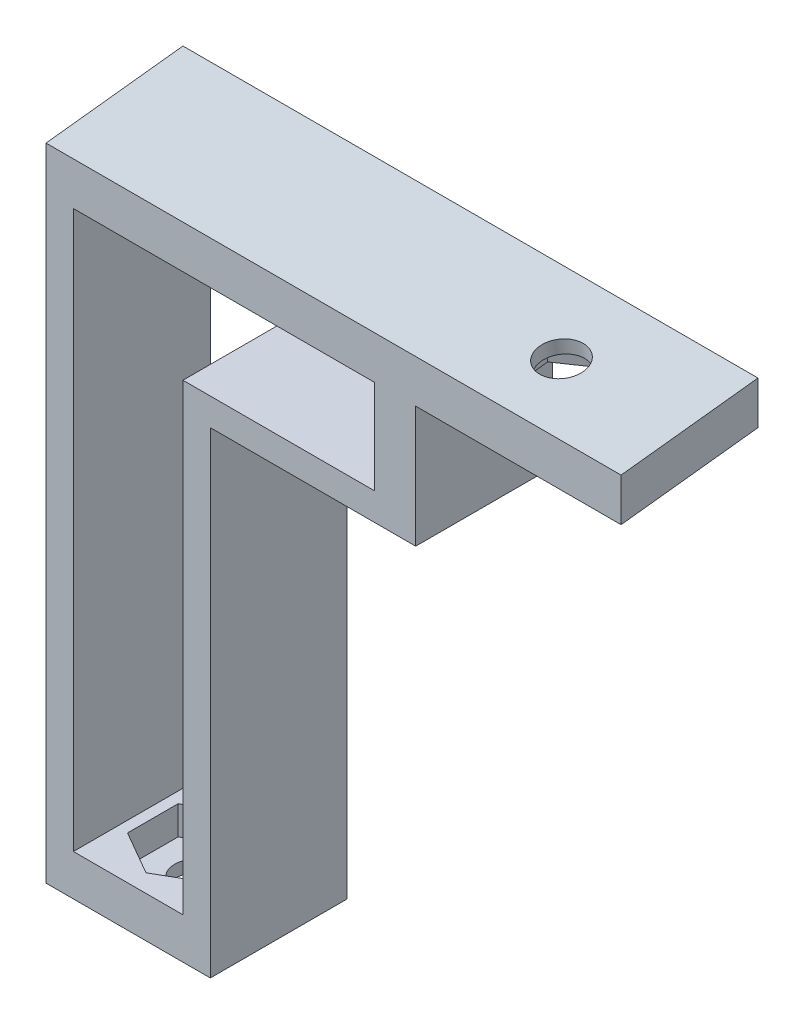
ISO-10303-21;
HEADER;
FILE_DESCRIPTION(('STEP AP214'),'2;1');
FILE_NAME('part.step','',(''),(''),'','','');
FILE_SCHEMA(('AUTOMOTIVE_DESIGN { 1 0 10303 214 1 1 1 1 }'));
ENDSEC;
DATA;
#1=APPLICATION_CONTEXT('core data for automotive mechanical design processes');
#2=APPLICATION_PROTOCOL_DEFINITION('international standard','automotive_design',2000,#1);
#3=PRODUCT_CONTEXT('',#1,'mechanical');
#4=PRODUCT('Part','Part','',(#3));
#5=PRODUCT_RELATED_PRODUCT_CATEGORY('part','',(#4));
#6=PRODUCT_DEFINITION_FORMATION('','',#4);
#7=PRODUCT_DEFINITION_CONTEXT('part definition',#1,'design');
#8=PRODUCT_DEFINITION('design','',#6,#7);
#9=PRODUCT_DEFINITION_SHAPE('','',#8);
#10=(LENGTH_UNIT() NAMED_UNIT(*) SI_UNIT(.MILLI.,.METRE.));
#11=(NAMED_UNIT(*) PLANE_ANGLE_UNIT() SI_UNIT($,.RADIAN.));
#12=(NAMED_UNIT(*) SI_UNIT($,.STERADIAN.) SOLID_ANGLE_UNIT());
#13=UNCERTAINTY_MEASURE_WITH_UNIT(LENGTH_MEASURE(1.E-05),#10,'distance_accuracy_value','');
#14=(GEOMETRIC_REPRESENTATION_CONTEXT(3) GLOBAL_UNCERTAINTY_ASSIGNED_CONTEXT((#13)) GLOBAL_UNIT_ASSIGNED_CONTEXT((#10,
#11,#12)) REPRESENTATION_CONTEXT('',''));
#15=CARTESIAN_POINT('',(0.,0.,0.));
#16=DIRECTION('',(0.,0.,1.));
#17=DIRECTION('',(1.,0.,0.));
#18=AXIS2_PLACEMENT_3D('',#15,#16,#17);
#19=CARTESIAN_POINT('',(15.,0.,-10.));
#20=DIRECTION('',(-1.,0.,0.));
#21=DIRECTION('',(0.,-1.,0.));
#22=AXIS2_PLACEMENT_3D('',#19,#20,#21);
#23=PLANE('',#22);
#24=DIRECTION('',(0.,-1.,0.));
#25=VECTOR('',#24,1.);
#26=CARTESIAN_POINT('',(15.,0.,-10.));
#27=LINE('',#26,#25);
#28=CARTESIAN_POINT('',(15.,44.81,-10.));
#29=VERTEX_POINT('',#28);
#30=CARTESIAN_POINT('',(15.,34.81,-10.));
#31=VERTEX_POINT('',#30);
#32=EDGE_CURVE('E363',#29,#31,#27,.T.);
#33=ORIENTED_EDGE('',*,*,#32,.F.);
#34=DIRECTION('',(0.,-0.1132032137679,0.993571855676588));
#35=VECTOR('',#34,1.);
#36=CARTESIAN_POINT('',(15.,44.2357613015133,-4.959971627426));
#37=LINE('',#36,#35);
#38=CARTESIAN_POINT('',(15.,43.6706439169836,0.));
#39=VERTEX_POINT('',#38);
#40=EDGE_CURVE('E344',#29,#39,#37,.T.);
#41=ORIENTED_EDGE('',*,*,#40,.T.);
#42=DIRECTION('',(0.,-1.,0.));
#43=VECTOR('',#42,1.);
#44=CARTESIAN_POINT('',(15.,0.,0.));
#45=LINE('',#44,#43);
#46=CARTESIAN_POINT('',(15.,34.81,0.));
#47=VERTEX_POINT('',#46);
#48=EDGE_CURVE('E388',#39,#47,#45,.T.);
#49=ORIENTED_EDGE('',*,*,#48,.T.);
#50=DIRECTION('',(0.,0.,1.));
#51=VECTOR('',#50,1.);
#52=CARTESIAN_POINT('',(15.,34.81,-10.));
#53=LINE('',#52,#51);
#54=EDGE_CURVE('E11',#31,#47,#53,.T.);
#55=ORIENTED_EDGE('',*,*,#54,.F.);
#56=EDGE_LOOP('',(#33,#41,#49,#55));
#57=FACE_BOUND('',#56,.T.);
#58=ADVANCED_FACE('F39',(#57),#23,.F.);
#59=CARTESIAN_POINT('',(0.,34.81,-10.));
#60=DIRECTION('',(0.,-1.,0.));
#61=DIRECTION('',(1.,0.,0.));
#62=AXIS2_PLACEMENT_3D('',#59,#60,#61);
#63=PLANE('',#62);
#64=DIRECTION('',(1.,0.,0.));
#65=VECTOR('',#64,1.);
#66=CARTESIAN_POINT('',(0.,34.81,0.));
#67=LINE('',#66,#65);
#68=CARTESIAN_POINT('',(0.,34.81,0.));
#69=VERTEX_POINT('',#68);
#70=EDGE_CURVE('E351',#69,#47,#67,.T.);
#71=ORIENTED_EDGE('',*,*,#70,.F.);
#72=DIRECTION('',(0.,0.,1.));
#73=VECTOR('',#72,1.);
#74=CARTESIAN_POINT('',(0.,34.81,-10.));
#75=LINE('',#74,#73);
#76=CARTESIAN_POINT('',(0.,34.81,-10.));
#77=VERTEX_POINT('',#76);
#78=EDGE_CURVE('E48',#77,#69,#75,.T.);
#79=ORIENTED_EDGE('',*,*,#78,.F.);
#80=DIRECTION('',(1.,0.,0.));
#81=VECTOR('',#80,1.);
#82=CARTESIAN_POINT('',(0.,34.81,-10.));
#83=LINE('',#82,#81);
#84=EDGE_CURVE('E375',#77,#31,#83,.T.);
#85=ORIENTED_EDGE('',*,*,#84,.T.);
#86=ORIENTED_EDGE('',*,*,#54,.T.);
#87=EDGE_LOOP('',(#71,#79,#85,#86));
#88=FACE_BOUND('',#87,.T.);
#89=ADVANCED_FACE('F464',(#88),#63,.T.);
#90=CARTESIAN_POINT('',(0.,0.,-10.));
#91=DIRECTION('',(1.,0.,0.));
#92=DIRECTION('',(0.,0.,-1.));
#93=AXIS2_PLACEMENT_3D('',#90,#91,#92);
#94=PLANE('',#93);
#95=DIRECTION('',(0.,1.,0.));
#96=VECTOR('',#95,1.);
#97=CARTESIAN_POINT('',(0.,0.,0.));
#98=LINE('',#97,#96);
#99=CARTESIAN_POINT('',(0.,0.,0.));
#100=VERTEX_POINT('',#99);
#101=EDGE_CURVE('E399',#100,#69,#98,.T.);
#102=ORIENTED_EDGE('',*,*,#101,.F.);
#103=DIRECTION('',(0.,0.,1.));
#104=VECTOR('',#103,1.);
#105=CARTESIAN_POINT('',(0.,0.,-10.));
#106=LINE('',#105,#104);
#107=CARTESIAN_POINT('',(0.,0.,-10.));
#108=VERTEX_POINT('',#107);
#109=EDGE_CURVE('E405',#108,#100,#106,.T.);
#110=ORIENTED_EDGE('',*,*,#109,.F.);
#111=DIRECTION('',(0.,1.,0.));
#112=VECTOR('',#111,1.);
#113=CARTESIAN_POINT('',(0.,0.,-10.));
#114=LINE('',#113,#112);
#115=EDGE_CURVE('E372',#108,#77,#114,.T.);
#116=ORIENTED_EDGE('',*,*,#115,.T.);
#117=ORIENTED_EDGE('',*,*,#78,.T.);
#118=EDGE_LOOP('',(#102,#110,#116,#117));
#119=FACE_BOUND('',#118,.T.);
#120=ADVANCED_FACE('F469',(#119),#94,.T.);
#121=CARTESIAN_POINT('',(0.,0.,-10.));
#122=DIRECTION('',(0.,-1.,0.));
#123=DIRECTION('',(0.,0.,-1.));
#124=AXIS2_PLACEMENT_3D('',#121,#122,#123);
#125=PLANE('',#124);
#126=CARTESIAN_POINT('',(-6.,0.,-5.));
#127=DIRECTION('',(0.,1.,0.));
#128=DIRECTION('',(0.,0.,1.));
#129=AXIS2_PLACEMENT_3D('',#126,#127,#128);
#130=CIRCLE('',#129,1.6);
#131=CARTESIAN_POINT('',(-6.,0.,-3.4));
#132=VERTEX_POINT('',#131);
#133=EDGE_CURVE('E561',#132,#132,#130,.T.);
#134=ORIENTED_EDGE('',*,*,#133,.T.);
#135=EDGE_LOOP('',(#134));
#136=FACE_BOUND('',#135,.T.);
#137=DIRECTION('',(1.,0.,0.));
#138=VECTOR('',#137,1.);
#139=CARTESIAN_POINT('',(0.,0.,0.));
#140=LINE('',#139,#138);
#141=CARTESIAN_POINT('',(-12.,0.,0.));
#142=VERTEX_POINT('',#141);
#143=EDGE_CURVE('E396',#142,#100,#140,.T.);
#144=ORIENTED_EDGE('',*,*,#143,.F.);
#145=DIRECTION('',(0.,0.,1.));
#146=VECTOR('',#145,1.);
#147=CARTESIAN_POINT('',(-12.,0.,-10.));
#148=LINE('',#147,#146);
#149=CARTESIAN_POINT('',(-12.,0.,-10.));
#150=VERTEX_POINT('',#149);
#151=EDGE_CURVE('E407',#150,#142,#148,.T.);
#152=ORIENTED_EDGE('',*,*,#151,.F.);
#153=DIRECTION('',(1.,0.,0.));
#154=VECTOR('',#153,1.);
#155=CARTESIAN_POINT('',(0.,0.,-10.));
#156=LINE('',#155,#154);
#157=EDGE_CURVE('E369',#150,#108,#156,.T.);
#158=ORIENTED_EDGE('',*,*,#157,.T.);
#159=ORIENTED_EDGE('',*,*,#109,.T.);
#160=EDGE_LOOP('',(#144,#152,#158,#159));
#161=FACE_BOUND('',#160,.T.);
#162=ADVANCED_FACE('F476',(#136,#161),#125,.T.);
#163=CARTESIAN_POINT('',(-12.,0.,-10.));
#164=DIRECTION('',(-1.,0.,0.));
#165=DIRECTION('',(0.,-1.,0.));
#166=AXIS2_PLACEMENT_3D('',#163,#164,#165);
#167=PLANE('',#166);
#168=ORIENTED_EDGE('',*,*,#151,.T.);
#169=DIRECTION('',(0.,-1.,0.));
#170=VECTOR('',#169,1.);
#171=CARTESIAN_POINT('',(-12.,0.,0.));
#172=LINE('',#171,#170);
#173=CARTESIAN_POINT('',(-12.,46.81,0.));
#174=VERTEX_POINT('',#173);
#175=EDGE_CURVE('E394',#174,#142,#172,.T.);
#176=ORIENTED_EDGE('',*,*,#175,.F.);
#177=DIRECTION('',(0.,0.1132032137679,-0.993571855676588));
#178=VECTOR('',#177,1.);
#179=CARTESIAN_POINT('',(-12.,46.2101313662985,5.26497942691786));
#180=LINE('',#179,#178);
#181=CARTESIAN_POINT('',(-12.,47.9493560830164,-10.));
#182=VERTEX_POINT('',#181);
#183=EDGE_CURVE('E327',#174,#182,#180,.T.);
#184=ORIENTED_EDGE('',*,*,#183,.T.);
#185=DIRECTION('',(0.,-1.,0.));
#186=VECTOR('',#185,1.);
#187=CARTESIAN_POINT('',(-12.,0.,-10.));
#188=LINE('',#187,#186);
#189=EDGE_CURVE('E367',#182,#150,#188,.T.);
#190=ORIENTED_EDGE('',*,*,#189,.T.);
#191=EDGE_LOOP('',(#168,#176,#184,#190));
#192=FACE_BOUND('',#191,.T.);
#193=ADVANCED_FACE('F459',(#192),#167,.T.);
#194=CARTESIAN_POINT('',(30.,0.,-10.));
#195=DIRECTION('',(1.,0.,0.));
#196=DIRECTION('',(0.,0.,-1.));
#197=AXIS2_PLACEMENT_3D('',#194,#195,#196);
#198=PLANE('',#197);
#199=DIRECTION('',(0.,1.,0.));
#200=VECTOR('',#199,1.);
#201=CARTESIAN_POINT('',(30.,0.,0.));
#202=LINE('',#201,#200);
#203=CARTESIAN_POINT('',(30.,43.6706439169836,0.));
#204=VERTEX_POINT('',#203);
#205=CARTESIAN_POINT('',(30.,46.81,0.));
#206=VERTEX_POINT('',#205);
#207=EDGE_CURVE('E390',#204,#206,#202,.T.);
#208=ORIENTED_EDGE('',*,*,#207,.F.);
#209=DIRECTION('',(0.,0.1132032137679,-0.993571855676588));
#210=VECTOR('',#209,1.);
#211=CARTESIAN_POINT('',(30.,43.111006029794,4.91187869650019));
#212=LINE('',#211,#210);
#213=CARTESIAN_POINT('',(30.,44.81,-10.));
#214=VERTEX_POINT('',#213);
#215=EDGE_CURVE('E330',#204,#214,#212,.T.);
#216=ORIENTED_EDGE('',*,*,#215,.T.);
#217=DIRECTION('',(0.,1.,0.));
#218=VECTOR('',#217,1.);
#219=CARTESIAN_POINT('',(30.,0.,-10.));
#220=LINE('',#219,#218);
#221=CARTESIAN_POINT('',(30.,47.9493560830164,-10.));
#222=VERTEX_POINT('',#221);
#223=EDGE_CURVE('E365',#214,#222,#220,.T.);
#224=ORIENTED_EDGE('',*,*,#223,.T.);
#225=DIRECTION('',(0.,0.1132032137679,-0.993571855676588));
#226=VECTOR('',#225,1.);
#227=CARTESIAN_POINT('',(30.,46.2101313662985,5.26497942691786));
#228=LINE('',#227,#226);
#229=EDGE_CURVE('E324',#206,#222,#228,.T.);
#230=ORIENTED_EDGE('',*,*,#229,.F.);
#231=EDGE_LOOP('',(#208,#216,#224,#230));
#232=FACE_BOUND('',#231,.T.);
#233=ADVANCED_FACE('F451',(#232),#198,.T.);
#234=CARTESIAN_POINT('',(-9.99999999999999,0.,-10.));
#235=DIRECTION('',(-1.,0.,0.));
#236=DIRECTION('',(0.,-1.,0.));
#237=AXIS2_PLACEMENT_3D('',#234,#235,#236);
#238=PLANE('',#237);
#239=DIRECTION('',(0.,-1.,0.));
#240=VECTOR('',#239,1.);
#241=CARTESIAN_POINT('',(-9.99999999999999,0.,-10.));
#242=LINE('',#241,#240);
#243=CARTESIAN_POINT('',(-10.,44.81,-10.));
#244=VERTEX_POINT('',#243);
#245=CARTESIAN_POINT('',(-9.99999999999999,3.,-10.));
#246=VERTEX_POINT('',#245);
#247=EDGE_CURVE('E361',#244,#246,#242,.T.);
#248=ORIENTED_EDGE('',*,*,#247,.F.);
#249=DIRECTION('',(0.,-0.1132032137679,0.993571855676588));
#250=VECTOR('',#249,1.);
#251=CARTESIAN_POINT('',(-10.,44.2357613015133,-4.959971627426));
#252=LINE('',#251,#250);
#253=CARTESIAN_POINT('',(-10.,43.6706439169836,0.));
#254=VERTEX_POINT('',#253);
#255=EDGE_CURVE('E342',#244,#254,#252,.T.);
#256=ORIENTED_EDGE('',*,*,#255,.T.);
#257=DIRECTION('',(0.,-1.,0.));
#258=VECTOR('',#257,1.);
#259=CARTESIAN_POINT('',(-9.99999999999999,0.,0.));
#260=LINE('',#259,#258);
#261=CARTESIAN_POINT('',(-9.99999999999999,3.,0.));
#262=VERTEX_POINT('',#261);
#263=EDGE_CURVE('E386',#254,#262,#260,.T.);
#264=ORIENTED_EDGE('',*,*,#263,.T.);
#265=DIRECTION('',(0.,0.,1.));
#266=VECTOR('',#265,1.);
#267=CARTESIAN_POINT('',(-9.99999999999999,3.,-10.));
#268=LINE('',#267,#266);
#269=EDGE_CURVE('E410',#246,#262,#268,.T.);
#270=ORIENTED_EDGE('',*,*,#269,.F.);
#271=EDGE_LOOP('',(#248,#256,#264,#270));
#272=FACE_BOUND('',#271,.T.);
#273=ADVANCED_FACE('F449',(#272),#238,.F.);
#274=CARTESIAN_POINT('',(0.,3.,-10.));
#275=DIRECTION('',(0.,-1.,0.));
#276=DIRECTION('',(0.,0.,-1.));
#277=AXIS2_PLACEMENT_3D('',#274,#275,#276);
#278=PLANE('',#277);
#279=DIRECTION('',(0.,0.,-1.));
#280=VECTOR('',#279,1.);
#281=CARTESIAN_POINT('',(-2.8,3.,-3.1524791385932));
#282=LINE('',#281,#280);
#283=CARTESIAN_POINT('',(-2.8,3.,-3.1524791385932));
#284=VERTEX_POINT('',#283);
#285=CARTESIAN_POINT('',(-2.8,3.,-6.8475208614068));
#286=VERTEX_POINT('',#285);
#287=EDGE_CURVE('E252',#284,#286,#282,.T.);
#288=ORIENTED_EDGE('',*,*,#287,.F.);
#289=DIRECTION('',(0.866025403784439,0.,-0.5));
#290=VECTOR('',#289,1.);
#291=CARTESIAN_POINT('',(-6.,3.,-1.30495827718639));
#292=LINE('',#291,#290);
#293=CARTESIAN_POINT('',(-6.,3.,-1.30495827718639));
#294=VERTEX_POINT('',#293);
#295=EDGE_CURVE('E56',#294,#284,#292,.T.);
#296=ORIENTED_EDGE('',*,*,#295,.F.);
#297=DIRECTION('',(0.866025403784439,0.,0.5));
#298=VECTOR('',#297,1.);
#299=CARTESIAN_POINT('',(-9.2,3.,-3.1524791385932));
#300=LINE('',#299,#298);
#301=CARTESIAN_POINT('',(-9.2,3.,-3.1524791385932));
#302=VERTEX_POINT('',#301);
#303=EDGE_CURVE('E235',#302,#294,#300,.T.);
#304=ORIENTED_EDGE('',*,*,#303,.F.);
#305=DIRECTION('',(0.,0.,1.));
#306=VECTOR('',#305,1.);
#307=CARTESIAN_POINT('',(-9.2,3.,-6.8475208614068));
#308=LINE('',#307,#306);
#309=CARTESIAN_POINT('',(-9.2,3.,-6.8475208614068));
#310=VERTEX_POINT('',#309);
#311=EDGE_CURVE('E238',#310,#302,#308,.T.);
#312=ORIENTED_EDGE('',*,*,#311,.F.);
#313=DIRECTION('',(-0.866025403784438,0.,0.5));
#314=VECTOR('',#313,1.);
#315=CARTESIAN_POINT('',(-6.,3.,-8.6950417228136));
#316=LINE('',#315,#314);
#317=CARTESIAN_POINT('',(-6.,3.,-8.6950417228136));
#318=VERTEX_POINT('',#317);
#319=EDGE_CURVE('E257',#318,#310,#316,.T.);
#320=ORIENTED_EDGE('',*,*,#319,.F.);
#321=DIRECTION('',(-0.866025403784438,0.,-0.5));
#322=VECTOR('',#321,1.);
#323=CARTESIAN_POINT('',(-2.8,3.,-6.8475208614068));
#324=LINE('',#323,#322);
#325=EDGE_CURVE('E254',#286,#318,#324,.T.);
#326=ORIENTED_EDGE('',*,*,#325,.F.);
#327=EDGE_LOOP('',(#288,#296,#304,#312,#320,#326));
#328=FACE_BOUND('',#327,.T.);
#329=DIRECTION('',(1.,0.,0.));
#330=VECTOR('',#329,1.);
#331=CARTESIAN_POINT('',(0.,3.,0.));
#332=LINE('',#331,#330);
#333=CARTESIAN_POINT('',(-2.,3.,0.));
#334=VERTEX_POINT('',#333);
#335=EDGE_CURVE('E384',#262,#334,#332,.T.);
#336=ORIENTED_EDGE('',*,*,#335,.T.);
#337=DIRECTION('',(0.,0.,1.));
#338=VECTOR('',#337,1.);
#339=CARTESIAN_POINT('',(-2.,3.,-10.));
#340=LINE('',#339,#338);
#341=CARTESIAN_POINT('',(-2.,3.,-10.));
#342=VERTEX_POINT('',#341);
#343=EDGE_CURVE('E413',#342,#334,#340,.T.);
#344=ORIENTED_EDGE('',*,*,#343,.F.);
#345=DIRECTION('',(1.,0.,0.));
#346=VECTOR('',#345,1.);
#347=CARTESIAN_POINT('',(0.,3.,-10.));
#348=LINE('',#347,#346);
#349=EDGE_CURVE('E359',#246,#342,#348,.T.);
#350=ORIENTED_EDGE('',*,*,#349,.F.);
#351=ORIENTED_EDGE('',*,*,#269,.T.);
#352=EDGE_LOOP('',(#336,#344,#350,#351));
#353=FACE_BOUND('',#352,.T.);
#354=ADVANCED_FACE('F446',(#328,#353),#278,.F.);
#355=CARTESIAN_POINT('',(-2.,0.,-10.));
#356=DIRECTION('',(1.,0.,0.));
#357=DIRECTION('',(0.,0.,-1.));
#358=AXIS2_PLACEMENT_3D('',#355,#356,#357);
#359=PLANE('',#358);
#360=DIRECTION('',(0.,1.,0.));
#361=VECTOR('',#360,1.);
#362=CARTESIAN_POINT('',(-2.,0.,0.));
#363=LINE('',#362,#361);
#364=CARTESIAN_POINT('',(-2.,36.81,0.));
#365=VERTEX_POINT('',#364);
#366=EDGE_CURVE('E382',#334,#365,#363,.T.);
#367=ORIENTED_EDGE('',*,*,#366,.T.);
#368=DIRECTION('',(0.,0.,1.));
#369=VECTOR('',#368,1.);
#370=CARTESIAN_POINT('',(-2.,36.81,-10.));
#371=LINE('',#370,#369);
#372=CARTESIAN_POINT('',(-2.,36.81,-10.));
#373=VERTEX_POINT('',#372);
#374=EDGE_CURVE('E415',#373,#365,#371,.T.);
#375=ORIENTED_EDGE('',*,*,#374,.F.);
#376=DIRECTION('',(0.,1.,0.));
#377=VECTOR('',#376,1.);
#378=CARTESIAN_POINT('',(-2.,0.,-10.));
#379=LINE('',#378,#377);
#380=EDGE_CURVE('E357',#342,#373,#379,.T.);
#381=ORIENTED_EDGE('',*,*,#380,.F.);
#382=ORIENTED_EDGE('',*,*,#343,.T.);
#383=EDGE_LOOP('',(#367,#375,#381,#382));
#384=FACE_BOUND('',#383,.T.);
#385=ADVANCED_FACE('F444',(#384),#359,.F.);
#386=CARTESIAN_POINT('',(0.,36.81,-10.));
#387=DIRECTION('',(0.,-1.,0.));
#388=DIRECTION('',(0.,0.,-1.));
#389=AXIS2_PLACEMENT_3D('',#386,#387,#388);
#390=PLANE('',#389);
#391=DIRECTION('',(1.,0.,0.));
#392=VECTOR('',#391,1.);
#393=CARTESIAN_POINT('',(0.,36.81,0.));
#394=LINE('',#393,#392);
#395=CARTESIAN_POINT('',(12.,36.81,0.));
#396=VERTEX_POINT('',#395);
#397=EDGE_CURVE('E379',#365,#396,#394,.T.);
#398=ORIENTED_EDGE('',*,*,#397,.T.);
#399=DIRECTION('',(0.,0.,1.));
#400=VECTOR('',#399,1.);
#401=CARTESIAN_POINT('',(12.,36.81,-10.));
#402=LINE('',#401,#400);
#403=CARTESIAN_POINT('',(12.,36.81,-10.));
#404=VERTEX_POINT('',#403);
#405=EDGE_CURVE('E43',#404,#396,#402,.T.);
#406=ORIENTED_EDGE('',*,*,#405,.F.);
#407=DIRECTION('',(1.,0.,0.));
#408=VECTOR('',#407,1.);
#409=CARTESIAN_POINT('',(0.,36.81,-10.));
#410=LINE('',#409,#408);
#411=EDGE_CURVE('E355',#373,#404,#410,.T.);
#412=ORIENTED_EDGE('',*,*,#411,.F.);
#413=ORIENTED_EDGE('',*,*,#374,.T.);
#414=EDGE_LOOP('',(#398,#406,#412,#413));
#415=FACE_BOUND('',#414,.T.);
#416=ADVANCED_FACE('F425',(#415),#390,.F.);
#417=CARTESIAN_POINT('',(12.,0.,-10.));
#418=DIRECTION('',(-1.,0.,0.));
#419=DIRECTION('',(0.,-1.,0.));
#420=AXIS2_PLACEMENT_3D('',#417,#418,#419);
#421=PLANE('',#420);
#422=DIRECTION('',(0.,-0.1132032137679,0.993571855676588));
#423=VECTOR('',#422,1.);
#424=CARTESIAN_POINT('',(12.,44.2357613015133,-4.959971627426));
#425=LINE('',#424,#423);
#426=CARTESIAN_POINT('',(12.,44.81,-10.));
#427=VERTEX_POINT('',#426);
#428=CARTESIAN_POINT('',(12.,43.6706439169836,0.));
#429=VERTEX_POINT('',#428);
#430=EDGE_CURVE('E339',#427,#429,#425,.T.);
#431=ORIENTED_EDGE('',*,*,#430,.F.);
#432=DIRECTION('',(0.,-1.,0.));
#433=VECTOR('',#432,1.);
#434=CARTESIAN_POINT('',(12.,0.,-10.));
#435=LINE('',#434,#433);
#436=EDGE_CURVE('E350',#427,#404,#435,.T.);
#437=ORIENTED_EDGE('',*,*,#436,.T.);
#438=ORIENTED_EDGE('',*,*,#405,.T.);
#439=DIRECTION('',(0.,-1.,0.));
#440=VECTOR('',#439,1.);
#441=CARTESIAN_POINT('',(12.,0.,0.));
#442=LINE('',#441,#440);
#443=EDGE_CURVE('E346',#429,#396,#442,.T.);
#444=ORIENTED_EDGE('',*,*,#443,.F.);
#445=EDGE_LOOP('',(#431,#437,#438,#444));
#446=FACE_BOUND('',#445,.T.);
#447=ADVANCED_FACE('F41',(#446),#421,.T.);
#448=CARTESIAN_POINT('',(0.,0.,-10.));
#449=DIRECTION('',(0.,0.,1.));
#450=DIRECTION('',(1.,0.,0.));
#451=AXIS2_PLACEMENT_3D('',#448,#449,#450);
#452=PLANE('',#451);
#453=DIRECTION('',(-1.,0.,0.));
#454=VECTOR('',#453,1.);
#455=CARTESIAN_POINT('',(0.,44.81,-10.));
#456=LINE('',#455,#454);
#457=EDGE_CURVE('E347',#427,#244,#456,.T.);
#458=ORIENTED_EDGE('',*,*,#457,.T.);
#459=ORIENTED_EDGE('',*,*,#247,.T.);
#460=ORIENTED_EDGE('',*,*,#349,.T.);
#461=ORIENTED_EDGE('',*,*,#380,.T.);
#462=ORIENTED_EDGE('',*,*,#411,.T.);
#463=ORIENTED_EDGE('',*,*,#436,.F.);
#464=EDGE_LOOP('',(#458,#459,#460,#461,#462,#463));
#465=FACE_BOUND('',#464,.T.);
#466=ORIENTED_EDGE('',*,*,#157,.F.);
#467=ORIENTED_EDGE('',*,*,#189,.F.);
#468=DIRECTION('',(1.,0.,0.));
#469=VECTOR('',#468,1.);
#470=CARTESIAN_POINT('',(-22.0646973269894,47.9493560830164,-10.));
#471=LINE('',#470,#469);
#472=EDGE_CURVE('E314',#182,#222,#471,.T.);
#473=ORIENTED_EDGE('',*,*,#472,.T.);
#474=ORIENTED_EDGE('',*,*,#223,.F.);
#475=EDGE_CURVE('E352',#214,#29,#456,.T.);
#476=ORIENTED_EDGE('',*,*,#475,.T.);
#477=ORIENTED_EDGE('',*,*,#32,.T.);
#478=ORIENTED_EDGE('',*,*,#84,.F.);
#479=ORIENTED_EDGE('',*,*,#115,.F.);
#480=EDGE_LOOP('',(#466,#467,#473,#474,#476,#477,#478,#479));
#481=FACE_BOUND('',#480,.T.);
#482=ADVANCED_FACE('F438',(#465,#481),#452,.F.);
#483=CARTESIAN_POINT('',(0.,0.,0.));
#484=DIRECTION('',(0.,0.,1.));
#485=DIRECTION('',(1.,0.,0.));
#486=AXIS2_PLACEMENT_3D('',#483,#484,#485);
#487=PLANE('',#486);
#488=ORIENTED_EDGE('',*,*,#48,.F.);
#489=DIRECTION('',(1.,0.,0.));
#490=VECTOR('',#489,1.);
#491=CARTESIAN_POINT('',(-22.0646973269894,43.6706439169836,0.));
#492=LINE('',#491,#490);
#493=EDGE_CURVE('E335',#39,#204,#492,.T.);
#494=ORIENTED_EDGE('',*,*,#493,.T.);
#495=ORIENTED_EDGE('',*,*,#207,.T.);
#496=DIRECTION('',(-1.,0.,0.));
#497=VECTOR('',#496,1.);
#498=CARTESIAN_POINT('',(0.,46.81,0.));
#499=LINE('',#498,#497);
#500=EDGE_CURVE('E392',#206,#174,#499,.T.);
#501=ORIENTED_EDGE('',*,*,#500,.T.);
#502=ORIENTED_EDGE('',*,*,#175,.T.);
#503=ORIENTED_EDGE('',*,*,#143,.T.);
#504=ORIENTED_EDGE('',*,*,#101,.T.);
#505=ORIENTED_EDGE('',*,*,#70,.T.);
#506=EDGE_LOOP('',(#488,#494,#495,#501,#502,#503,#504,#505));
#507=FACE_BOUND('',#506,.T.);
#508=ORIENTED_EDGE('',*,*,#263,.F.);
#509=EDGE_CURVE('E338',#254,#429,#492,.T.);
#510=ORIENTED_EDGE('',*,*,#509,.T.);
#511=ORIENTED_EDGE('',*,*,#443,.T.);
#512=ORIENTED_EDGE('',*,*,#397,.F.);
#513=ORIENTED_EDGE('',*,*,#366,.F.);
#514=ORIENTED_EDGE('',*,*,#335,.F.);
#515=EDGE_LOOP('',(#508,#510,#511,#512,#513,#514));
#516=FACE_BOUND('',#515,.T.);
#517=ADVANCED_FACE('F429',(#507,#516),#487,.T.);
#518=CARTESIAN_POINT('',(-22.0646973269894,43.111006029794,4.91187869650019));
#519=DIRECTION('',(0.,-0.993571855676588,-0.1132032137679));
#520=DIRECTION('',(0.,0.1132032137679,-0.993571855676588));
#521=AXIS2_PLACEMENT_3D('',#518,#519,#520);
#522=PLANE('',#521);
#523=DIRECTION('',(0.,-0.113203213767901,0.993571855676588));
#524=VECTOR('',#523,1.);
#525=CARTESIAN_POINT('',(24.2,44.4494672575063,-6.83564473066917));
#526=LINE('',#525,#524);
#527=CARTESIAN_POINT('',(24.2,44.4494672575063,-6.83564473066917));
#528=VERTEX_POINT('',#527);
#529=CARTESIAN_POINT('',(24.2,44.0311766594773,-3.16435526933084));
#530=VERTEX_POINT('',#529);
#531=EDGE_CURVE('E64',#528,#530,#526,.T.);
#532=ORIENTED_EDGE('',*,*,#531,.F.);
#533=DIRECTION('',(0.866025403784439,-0.0566016068839497,0.496785927838294));
#534=VECTOR('',#533,1.);
#535=CARTESIAN_POINT('',(21.,44.6586125565208,-8.67128946133834));
#536=LINE('',#535,#534);
#537=CARTESIAN_POINT('',(21.,44.6586125565208,-8.67128946133834));
#538=VERTEX_POINT('',#537);
#539=EDGE_CURVE('E281',#538,#528,#536,.T.);
#540=ORIENTED_EDGE('',*,*,#539,.F.);
#541=DIRECTION('',(0.866025403784439,0.0566016068839495,-0.496785927838294));
#542=VECTOR('',#541,1.);
#543=CARTESIAN_POINT('',(17.8,44.4494672575063,-6.83564473066917));
#544=LINE('',#543,#542);
#545=CARTESIAN_POINT('',(17.8,44.4494672575063,-6.83564473066917));
#546=VERTEX_POINT('',#545);
#547=EDGE_CURVE('E307',#546,#538,#544,.T.);
#548=ORIENTED_EDGE('',*,*,#547,.F.);
#549=DIRECTION('',(0.,0.113203213767901,-0.993571855676588));
#550=VECTOR('',#549,1.);
#551=CARTESIAN_POINT('',(17.8,44.0311766594773,-3.16435526933083));
#552=LINE('',#551,#550);
#553=CARTESIAN_POINT('',(17.8,44.0311766594773,-3.16435526933083));
#554=VERTEX_POINT('',#553);
#555=EDGE_CURVE('E304',#554,#546,#552,.T.);
#556=ORIENTED_EDGE('',*,*,#555,.F.);
#557=DIRECTION('',(-0.866025403784439,0.0566016068839496,-0.496785927838294));
#558=VECTOR('',#557,1.);
#559=CARTESIAN_POINT('',(21.,43.8220313604629,-1.32871053866167));
#560=LINE('',#559,#558);
#561=CARTESIAN_POINT('',(21.,43.8220313604629,-1.32871053866167));
#562=VERTEX_POINT('',#561);
#563=EDGE_CURVE('E301',#562,#554,#560,.T.);
#564=ORIENTED_EDGE('',*,*,#563,.F.);
#565=DIRECTION('',(-0.866025403784438,-0.0566016068839497,0.496785927838294));
#566=VECTOR('',#565,1.);
#567=CARTESIAN_POINT('',(24.2,44.0311766594773,-3.16435526933083));
#568=LINE('',#567,#566);
#569=EDGE_CURVE('E298',#530,#562,#568,.T.);
#570=ORIENTED_EDGE('',*,*,#569,.F.);
#571=EDGE_LOOP('',(#532,#540,#548,#556,#564,#570));
#572=FACE_BOUND('',#571,.T.);
#573=ORIENTED_EDGE('',*,*,#40,.F.);
#574=ORIENTED_EDGE('',*,*,#475,.F.);
#575=ORIENTED_EDGE('',*,*,#215,.F.);
#576=ORIENTED_EDGE('',*,*,#493,.F.);
#577=EDGE_LOOP('',(#573,#574,#575,#576));
#578=FACE_BOUND('',#577,.T.);
#579=ADVANCED_FACE('F486',(#572,#578),#522,.T.);
#580=ORIENTED_EDGE('',*,*,#255,.F.);
#581=ORIENTED_EDGE('',*,*,#457,.F.);
#582=ORIENTED_EDGE('',*,*,#430,.T.);
#583=ORIENTED_EDGE('',*,*,#509,.F.);
#584=EDGE_LOOP('',(#580,#581,#582,#583));
#585=FACE_BOUND('',#584,.T.);
#586=ADVANCED_FACE('F435',(#585),#522,.T.);
#587=CARTESIAN_POINT('',(-22.0646973269894,46.2101313662985,5.26497942691786));
#588=DIRECTION('',(0.,-0.993571855676588,-0.1132032137679));
#589=DIRECTION('',(0.,0.1132032137679,-0.993571855676588));
#590=AXIS2_PLACEMENT_3D('',#587,#588,#589);
#591=PLANE('',#590);
#592=CARTESIAN_POINT('',(21.,47.3394472949963,-4.64689926958234));
#593=DIRECTION('',(0.,-0.993571855676588,-0.1132032137679));
#594=DIRECTION('',(0.,0.1132032137679,-0.993571855676588));
#595=AXIS2_PLACEMENT_3D('',#592,#593,#594);
#596=CIRCLE('',#595,1.6);
#597=CARTESIAN_POINT('',(21.,47.520572437025,-6.23661423866488));
#598=VERTEX_POINT('',#597);
#599=EDGE_CURVE('E274',#598,#598,#596,.T.);
#600=ORIENTED_EDGE('',*,*,#599,.T.);
#601=EDGE_LOOP('',(#600));
#602=FACE_BOUND('',#601,.T.);
#603=ORIENTED_EDGE('',*,*,#183,.F.);
#604=ORIENTED_EDGE('',*,*,#500,.F.);
#605=ORIENTED_EDGE('',*,*,#229,.T.);
#606=ORIENTED_EDGE('',*,*,#472,.F.);
#607=EDGE_LOOP('',(#603,#604,#605,#606));
#608=FACE_BOUND('',#607,.T.);
#609=ADVANCED_FACE('F493',(#602,#608),#591,.F.);
#610=CARTESIAN_POINT('',(24.2,46.5359681544272,-6.59791798175658));
#611=DIRECTION('',(1.,0.,0.));
#612=DIRECTION('',(0.,1.,0.));
#613=AXIS2_PLACEMENT_3D('',#610,#611,#612);
#614=PLANE('',#613);
#615=ORIENTED_EDGE('',*,*,#531,.T.);
#616=DIRECTION('',(0.,-0.993571855676588,-0.1132032137679));
#617=VECTOR('',#616,1.);
#618=CARTESIAN_POINT('',(24.2,46.1176775563982,-2.92662852041824));
#619=LINE('',#618,#617);
#620=CARTESIAN_POINT('',(24.2,46.1176775563982,-2.92662852041824));
#621=VERTEX_POINT('',#620);
#622=EDGE_CURVE('E296',#621,#530,#619,.T.);
#623=ORIENTED_EDGE('',*,*,#622,.F.);
#624=DIRECTION('',(0.,-0.113203213767901,0.993571855676588));
#625=VECTOR('',#624,1.);
#626=CARTESIAN_POINT('',(24.2,46.5359681544272,-6.59791798175658));
#627=LINE('',#626,#625);
#628=CARTESIAN_POINT('',(24.2,46.5359681544272,-6.59791798175658));
#629=VERTEX_POINT('',#628);
#630=EDGE_CURVE('E277',#629,#621,#627,.T.);
#631=ORIENTED_EDGE('',*,*,#630,.F.);
#632=DIRECTION('',(0.,-0.993571855676588,-0.1132032137679));
#633=VECTOR('',#632,1.);
#634=CARTESIAN_POINT('',(24.2,46.5359681544272,-6.59791798175658));
#635=LINE('',#634,#633);
#636=EDGE_CURVE('E312',#629,#528,#635,.T.);
#637=ORIENTED_EDGE('',*,*,#636,.T.);
#638=EDGE_LOOP('',(#615,#623,#631,#637));
#639=FACE_BOUND('',#638,.T.);
#640=ADVANCED_FACE('F496',(#639),#614,.F.);
#641=CARTESIAN_POINT('',(21.,46.7451134534416,-8.43356271242575));
#642=DIRECTION('',(0.5,0.0980368589130417,-0.860458467501171));
#643=DIRECTION('',(-0.864623545564125,0.,-0.502420266764908));
#644=AXIS2_PLACEMENT_3D('',#641,#642,#643);
#645=PLANE('',#644);
#646=ORIENTED_EDGE('',*,*,#539,.T.);
#647=ORIENTED_EDGE('',*,*,#636,.F.);
#648=DIRECTION('',(0.866025403784439,-0.0566016068839497,0.496785927838294));
#649=VECTOR('',#648,1.);
#650=CARTESIAN_POINT('',(21.,46.7451134534416,-8.43356271242575));
#651=LINE('',#650,#649);
#652=CARTESIAN_POINT('',(21.,46.7451134534416,-8.43356271242575));
#653=VERTEX_POINT('',#652);
#654=EDGE_CURVE('E293',#653,#629,#651,.T.);
#655=ORIENTED_EDGE('',*,*,#654,.F.);
#656=DIRECTION('',(0.,-0.993571855676588,-0.1132032137679));
#657=VECTOR('',#656,1.);
#658=CARTESIAN_POINT('',(21.,46.7451134534416,-8.43356271242575));
#659=LINE('',#658,#657);
#660=EDGE_CURVE('E315',#653,#538,#659,.T.);
#661=ORIENTED_EDGE('',*,*,#660,.T.);
#662=EDGE_LOOP('',(#646,#647,#655,#661));
#663=FACE_BOUND('',#662,.T.);
#664=ADVANCED_FACE('F500',(#663),#645,.F.);
#665=CARTESIAN_POINT('',(17.8,46.5359681544272,-6.59791798175658));
#666=DIRECTION('',(-0.5,0.0980368589130418,-0.860458467501171));
#667=DIRECTION('',(-0.864623545564125,0.,0.502420266764908));
#668=AXIS2_PLACEMENT_3D('',#665,#666,#667);
#669=PLANE('',#668);
#670=ORIENTED_EDGE('',*,*,#547,.T.);
#671=ORIENTED_EDGE('',*,*,#660,.F.);
#672=DIRECTION('',(0.866025403784439,0.0566016068839495,-0.496785927838294));
#673=VECTOR('',#672,1.);
#674=CARTESIAN_POINT('',(17.8,46.5359681544272,-6.59791798175658));
#675=LINE('',#674,#673);
#676=CARTESIAN_POINT('',(17.8,46.5359681544272,-6.59791798175658));
#677=VERTEX_POINT('',#676);
#678=EDGE_CURVE('E290',#677,#653,#675,.T.);
#679=ORIENTED_EDGE('',*,*,#678,.F.);
#680=DIRECTION('',(0.,-0.993571855676588,-0.1132032137679));
#681=VECTOR('',#680,1.);
#682=CARTESIAN_POINT('',(17.8,46.5359681544272,-6.59791798175658));
#683=LINE('',#682,#681);
#684=EDGE_CURVE('E317',#677,#546,#683,.T.);
#685=ORIENTED_EDGE('',*,*,#684,.T.);
#686=EDGE_LOOP('',(#670,#671,#679,#685));
#687=FACE_BOUND('',#686,.T.);
#688=ADVANCED_FACE('F513',(#687),#669,.F.);
#689=CARTESIAN_POINT('',(17.8,46.1176775563982,-2.92662852041824));
#690=DIRECTION('',(-1.,0.,0.));
#691=DIRECTION('',(0.,-1.,0.));
#692=AXIS2_PLACEMENT_3D('',#689,#690,#691);
#693=PLANE('',#692);
#694=ORIENTED_EDGE('',*,*,#555,.T.);
#695=ORIENTED_EDGE('',*,*,#684,.F.);
#696=DIRECTION('',(0.,0.113203213767901,-0.993571855676588));
#697=VECTOR('',#696,1.);
#698=CARTESIAN_POINT('',(17.8,46.1176775563982,-2.92662852041824));
#699=LINE('',#698,#697);
#700=CARTESIAN_POINT('',(17.8,46.1176775563982,-2.92662852041824));
#701=VERTEX_POINT('',#700);
#702=EDGE_CURVE('E287',#701,#677,#699,.T.);
#703=ORIENTED_EDGE('',*,*,#702,.F.);
#704=DIRECTION('',(0.,-0.993571855676588,-0.1132032137679));
#705=VECTOR('',#704,1.);
#706=CARTESIAN_POINT('',(17.8,46.1176775563982,-2.92662852041824));
#707=LINE('',#706,#705);
#708=EDGE_CURVE('E319',#701,#554,#707,.T.);
#709=ORIENTED_EDGE('',*,*,#708,.T.);
#710=EDGE_LOOP('',(#694,#695,#703,#709));
#711=FACE_BOUND('',#710,.T.);
#712=ADVANCED_FACE('F509',(#711),#693,.F.);
#713=CARTESIAN_POINT('',(21.,45.9085322573837,-1.09098378974908));
#714=DIRECTION('',(-0.5,-0.0980368589130417,0.860458467501172));
#715=DIRECTION('',(0.864623545564125,0.,0.502420266764907));
#716=AXIS2_PLACEMENT_3D('',#713,#714,#715);
#717=PLANE('',#716);
#718=ORIENTED_EDGE('',*,*,#563,.T.);
#719=ORIENTED_EDGE('',*,*,#708,.F.);
#720=DIRECTION('',(-0.866025403784439,0.0566016068839496,-0.496785927838294));
#721=VECTOR('',#720,1.);
#722=CARTESIAN_POINT('',(21.,45.9085322573837,-1.09098378974908));
#723=LINE('',#722,#721);
#724=CARTESIAN_POINT('',(21.,45.9085322573837,-1.09098378974908));
#725=VERTEX_POINT('',#724);
#726=EDGE_CURVE('E284',#725,#701,#723,.T.);
#727=ORIENTED_EDGE('',*,*,#726,.F.);
#728=DIRECTION('',(0.,-0.993571855676588,-0.1132032137679));
#729=VECTOR('',#728,1.);
#730=CARTESIAN_POINT('',(21.,45.9085322573837,-1.09098378974908));
#731=LINE('',#730,#729);
#732=EDGE_CURVE('E321',#725,#562,#731,.T.);
#733=ORIENTED_EDGE('',*,*,#732,.T.);
#734=EDGE_LOOP('',(#718,#719,#727,#733));
#735=FACE_BOUND('',#734,.T.);
#736=ADVANCED_FACE('F505',(#735),#717,.F.);
#737=CARTESIAN_POINT('',(24.2,46.1176775563982,-2.92662852041824));
#738=DIRECTION('',(0.5,-0.0980368589130418,0.860458467501171));
#739=DIRECTION('',(0.864623545564125,0.,-0.502420266764908));
#740=AXIS2_PLACEMENT_3D('',#737,#738,#739);
#741=PLANE('',#740);
#742=ORIENTED_EDGE('',*,*,#569,.T.);
#743=ORIENTED_EDGE('',*,*,#732,.F.);
#744=DIRECTION('',(-0.866025403784438,-0.0566016068839497,0.496785927838294));
#745=VECTOR('',#744,1.);
#746=CARTESIAN_POINT('',(24.2,46.1176775563982,-2.92662852041824));
#747=LINE('',#746,#745);
#748=EDGE_CURVE('E280',#621,#725,#747,.T.);
#749=ORIENTED_EDGE('',*,*,#748,.F.);
#750=ORIENTED_EDGE('',*,*,#622,.T.);
#751=EDGE_LOOP('',(#742,#743,#749,#750));
#752=FACE_BOUND('',#751,.T.);
#753=ADVANCED_FACE('F501',(#752),#741,.F.);
#754=CARTESIAN_POINT('',(0.,45.1975069267149,5.14960544541282));
#755=DIRECTION('',(0.,-0.993571855676588,-0.113203213767901));
#756=DIRECTION('',(0.,0.113203213767901,-0.993571855676588));
#757=AXIS2_PLACEMENT_3D('',#754,#755,#756);
#758=PLANE('',#757);
#759=CARTESIAN_POINT('',(21.,46.3268228554127,-4.76227325108741));
#760=DIRECTION('',(0.,-0.993571855676588,-0.113203213767901));
#761=DIRECTION('',(0.,0.113203213767901,-0.993571855676588));
#762=AXIS2_PLACEMENT_3D('',#759,#760,#761);
#763=CIRCLE('',#762,1.6);
#764=CARTESIAN_POINT('',(21.,46.5079479974413,-6.35198822016995));
#765=VERTEX_POINT('',#764);
#766=EDGE_CURVE('E264',#765,#765,#763,.T.);
#767=ORIENTED_EDGE('',*,*,#766,.F.);
#768=EDGE_LOOP('',(#767));
#769=FACE_BOUND('',#768,.T.);
#770=ORIENTED_EDGE('',*,*,#630,.T.);
#771=ORIENTED_EDGE('',*,*,#748,.T.);
#772=ORIENTED_EDGE('',*,*,#726,.T.);
#773=ORIENTED_EDGE('',*,*,#702,.T.);
#774=ORIENTED_EDGE('',*,*,#678,.T.);
#775=ORIENTED_EDGE('',*,*,#654,.T.);
#776=EDGE_LOOP('',(#770,#771,#772,#773,#774,#775));
#777=FACE_BOUND('',#776,.T.);
#778=ADVANCED_FACE('F504',(#769,#777),#758,.T.);
#779=CARTESIAN_POINT('',(21.,48.4642025667156,-4.51874959350853));
#780=DIRECTION('',(0.,-0.993571855676588,-0.1132032137679));
#781=DIRECTION('',(0.,0.1132032137679,-0.993571855676588));
#782=AXIS2_PLACEMENT_3D('',#779,#780,#781);
#783=CYLINDRICAL_SURFACE('',#782,1.6);
#784=ORIENTED_EDGE('',*,*,#766,.T.);
#785=EDGE_LOOP('',(#784));
#786=FACE_BOUND('',#785,.T.);
#787=ORIENTED_EDGE('',*,*,#599,.F.);
#788=EDGE_LOOP('',(#787));
#789=FACE_BOUND('',#788,.T.);
#790=ADVANCED_FACE('F523',(#786,#789),#783,.F.);
#791=CARTESIAN_POINT('',(-6.,0.9,-1.30495827718639));
#792=DIRECTION('',(0.5,0.,0.866025403784439));
#793=DIRECTION('',(0.866025403784439,0.,-0.5));
#794=AXIS2_PLACEMENT_3D('',#791,#792,#793);
#795=PLANE('',#794);
#796=ORIENTED_EDGE('',*,*,#295,.T.);
#797=DIRECTION('',(0.,1.,0.));
#798=VECTOR('',#797,1.);
#799=CARTESIAN_POINT('',(-2.8,0.9,-3.1524791385932));
#800=LINE('',#799,#798);
#801=CARTESIAN_POINT('',(-2.8,0.9,-3.1524791385932));
#802=VERTEX_POINT('',#801);
#803=EDGE_CURVE('E212',#802,#284,#800,.T.);
#804=ORIENTED_EDGE('',*,*,#803,.F.);
#805=DIRECTION('',(0.866025403784439,0.,-0.5));
#806=VECTOR('',#805,1.);
#807=CARTESIAN_POINT('',(-6.,0.9,-1.30495827718639));
#808=LINE('',#807,#806);
#809=CARTESIAN_POINT('',(-6.,0.9,-1.30495827718639));
#810=VERTEX_POINT('',#809);
#811=EDGE_CURVE('E216',#810,#802,#808,.T.);
#812=ORIENTED_EDGE('',*,*,#811,.F.);
#813=DIRECTION('',(0.,1.,0.));
#814=VECTOR('',#813,1.);
#815=CARTESIAN_POINT('',(-6.,0.9,-1.30495827718639));
#816=LINE('',#815,#814);
#817=EDGE_CURVE('E262',#810,#294,#816,.T.);
#818=ORIENTED_EDGE('',*,*,#817,.T.);
#819=EDGE_LOOP('',(#796,#804,#812,#818));
#820=FACE_BOUND('',#819,.T.);
#821=ADVANCED_FACE('F214',(#820),#795,.F.);
#822=CARTESIAN_POINT('',(-9.2,0.9,-3.1524791385932));
#823=DIRECTION('',(-0.5,0.,0.866025403784439));
#824=DIRECTION('',(0.866025403784439,0.,0.5));
#825=AXIS2_PLACEMENT_3D('',#822,#823,#824);
#826=PLANE('',#825);
#827=ORIENTED_EDGE('',*,*,#303,.T.);
#828=ORIENTED_EDGE('',*,*,#817,.F.);
#829=DIRECTION('',(0.866025403784439,0.,0.5));
#830=VECTOR('',#829,1.);
#831=CARTESIAN_POINT('',(-9.2,0.9,-3.1524791385932));
#832=LINE('',#831,#830);
#833=CARTESIAN_POINT('',(-9.2,0.9,-3.1524791385932));
#834=VERTEX_POINT('',#833);
#835=EDGE_CURVE('E222',#834,#810,#832,.T.);
#836=ORIENTED_EDGE('',*,*,#835,.F.);
#837=DIRECTION('',(0.,1.,0.));
#838=VECTOR('',#837,1.);
#839=CARTESIAN_POINT('',(-9.2,0.9,-3.1524791385932));
#840=LINE('',#839,#838);
#841=EDGE_CURVE('E265',#834,#302,#840,.T.);
#842=ORIENTED_EDGE('',*,*,#841,.T.);
#843=EDGE_LOOP('',(#827,#828,#836,#842));
#844=FACE_BOUND('',#843,.T.);
#845=ADVANCED_FACE('F530',(#844),#826,.F.);
#846=CARTESIAN_POINT('',(-9.2,0.9,-6.8475208614068));
#847=DIRECTION('',(-1.,0.,0.));
#848=DIRECTION('',(0.,0.,1.));
#849=AXIS2_PLACEMENT_3D('',#846,#847,#848);
#850=PLANE('',#849);
#851=ORIENTED_EDGE('',*,*,#311,.T.);
#852=ORIENTED_EDGE('',*,*,#841,.F.);
#853=DIRECTION('',(0.,0.,1.));
#854=VECTOR('',#853,1.);
#855=CARTESIAN_POINT('',(-9.2,0.9,-6.8475208614068));
#856=LINE('',#855,#854);
#857=CARTESIAN_POINT('',(-9.2,0.9,-6.8475208614068));
#858=VERTEX_POINT('',#857);
#859=EDGE_CURVE('E248',#858,#834,#856,.T.);
#860=ORIENTED_EDGE('',*,*,#859,.F.);
#861=DIRECTION('',(0.,1.,0.));
#862=VECTOR('',#861,1.);
#863=CARTESIAN_POINT('',(-9.2,0.9,-6.8475208614068));
#864=LINE('',#863,#862);
#865=EDGE_CURVE('E267',#858,#310,#864,.T.);
#866=ORIENTED_EDGE('',*,*,#865,.T.);
#867=EDGE_LOOP('',(#851,#852,#860,#866));
#868=FACE_BOUND('',#867,.T.);
#869=ADVANCED_FACE('F540',(#868),#850,.F.);
#870=CARTESIAN_POINT('',(-6.,0.9,-8.6950417228136));
#871=DIRECTION('',(-0.5,0.,-0.866025403784438));
#872=DIRECTION('',(-0.866025403784439,0.,0.5));
#873=AXIS2_PLACEMENT_3D('',#870,#871,#872);
#874=PLANE('',#873);
#875=ORIENTED_EDGE('',*,*,#319,.T.);
#876=ORIENTED_EDGE('',*,*,#865,.F.);
#877=DIRECTION('',(-0.866025403784438,0.,0.5));
#878=VECTOR('',#877,1.);
#879=CARTESIAN_POINT('',(-6.,0.9,-8.6950417228136));
#880=LINE('',#879,#878);
#881=CARTESIAN_POINT('',(-6.,0.9,-8.6950417228136));
#882=VERTEX_POINT('',#881);
#883=EDGE_CURVE('E245',#882,#858,#880,.T.);
#884=ORIENTED_EDGE('',*,*,#883,.F.);
#885=DIRECTION('',(0.,1.,0.));
#886=VECTOR('',#885,1.);
#887=CARTESIAN_POINT('',(-6.,0.9,-8.6950417228136));
#888=LINE('',#887,#886);
#889=EDGE_CURVE('E269',#882,#318,#888,.T.);
#890=ORIENTED_EDGE('',*,*,#889,.T.);
#891=EDGE_LOOP('',(#875,#876,#884,#890));
#892=FACE_BOUND('',#891,.T.);
#893=ADVANCED_FACE('F536',(#892),#874,.F.);
#894=CARTESIAN_POINT('',(-2.8,0.9,-6.8475208614068));
#895=DIRECTION('',(0.5,0.,-0.866025403784438));
#896=DIRECTION('',(-0.866025403784439,0.,-0.5));
#897=AXIS2_PLACEMENT_3D('',#894,#895,#896);
#898=PLANE('',#897);
#899=ORIENTED_EDGE('',*,*,#325,.T.);
#900=ORIENTED_EDGE('',*,*,#889,.F.);
#901=DIRECTION('',(-0.866025403784438,0.,-0.5));
#902=VECTOR('',#901,1.);
#903=CARTESIAN_POINT('',(-2.8,0.9,-6.8475208614068));
#904=LINE('',#903,#902);
#905=CARTESIAN_POINT('',(-2.8,0.9,-6.8475208614068));
#906=VERTEX_POINT('',#905);
#907=EDGE_CURVE('E230',#906,#882,#904,.T.);
#908=ORIENTED_EDGE('',*,*,#907,.F.);
#909=DIRECTION('',(0.,1.,0.));
#910=VECTOR('',#909,1.);
#911=CARTESIAN_POINT('',(-2.8,0.9,-6.8475208614068));
#912=LINE('',#911,#910);
#913=EDGE_CURVE('E221',#906,#286,#912,.T.);
#914=ORIENTED_EDGE('',*,*,#913,.T.);
#915=EDGE_LOOP('',(#899,#900,#908,#914));
#916=FACE_BOUND('',#915,.T.);
#917=ADVANCED_FACE('F533',(#916),#898,.F.);
#918=CARTESIAN_POINT('',(-2.8,0.9,-3.1524791385932));
#919=DIRECTION('',(1.,0.,0.));
#920=DIRECTION('',(0.,0.,-1.));
#921=AXIS2_PLACEMENT_3D('',#918,#919,#920);
#922=PLANE('',#921);
#923=ORIENTED_EDGE('',*,*,#287,.T.);
#924=ORIENTED_EDGE('',*,*,#913,.F.);
#925=DIRECTION('',(0.,0.,-1.));
#926=VECTOR('',#925,1.);
#927=CARTESIAN_POINT('',(-2.8,0.9,-3.1524791385932));
#928=LINE('',#927,#926);
#929=EDGE_CURVE('E225',#802,#906,#928,.T.);
#930=ORIENTED_EDGE('',*,*,#929,.F.);
#931=ORIENTED_EDGE('',*,*,#803,.T.);
#932=EDGE_LOOP('',(#923,#924,#930,#931));
#933=FACE_BOUND('',#932,.T.);
#934=ADVANCED_FACE('F226',(#933),#922,.F.);
#935=CARTESIAN_POINT('',(0.,0.9,0.));
#936=DIRECTION('',(0.,1.,0.));
#937=DIRECTION('',(0.,0.,1.));
#938=AXIS2_PLACEMENT_3D('',#935,#936,#937);
#939=PLANE('',#938);
#940=CARTESIAN_POINT('',(-6.,0.9,-5.));
#941=DIRECTION('',(0.,1.,0.));
#942=DIRECTION('',(0.,0.,1.));
#943=AXIS2_PLACEMENT_3D('',#940,#941,#942);
#944=CIRCLE('',#943,1.6);
#945=CARTESIAN_POINT('',(-6.,0.9,-3.4));
#946=VERTEX_POINT('',#945);
#947=EDGE_CURVE('E241',#946,#946,#944,.T.);
#948=ORIENTED_EDGE('',*,*,#947,.F.);
#949=EDGE_LOOP('',(#948));
#950=FACE_BOUND('',#949,.T.);
#951=ORIENTED_EDGE('',*,*,#811,.T.);
#952=ORIENTED_EDGE('',*,*,#929,.T.);
#953=ORIENTED_EDGE('',*,*,#907,.T.);
#954=ORIENTED_EDGE('',*,*,#883,.T.);
#955=ORIENTED_EDGE('',*,*,#859,.T.);
#956=ORIENTED_EDGE('',*,*,#835,.T.);
#957=EDGE_LOOP('',(#951,#952,#953,#954,#955,#956));
#958=FACE_BOUND('',#957,.T.);
#959=ADVANCED_FACE('F232',(#950,#958),#939,.T.);
#960=CARTESIAN_POINT('',(-6.,0.,-5.));
#961=DIRECTION('',(0.,1.,0.));
#962=DIRECTION('',(0.,0.,1.));
#963=AXIS2_PLACEMENT_3D('',#960,#961,#962);
#964=CYLINDRICAL_SURFACE('',#963,1.6);
#965=ORIENTED_EDGE('',*,*,#947,.T.);
#966=EDGE_LOOP('',(#965));
#967=FACE_BOUND('',#966,.T.);
#968=ORIENTED_EDGE('',*,*,#133,.F.);
#969=EDGE_LOOP('',(#968));
#970=FACE_BOUND('',#969,.T.);
#971=ADVANCED_FACE('F550',(#967,#970),#964,.F.);
#972=CLOSED_SHELL('',(#58,#89,#120,#162,#193,#233,#273,#354,#385,#416,#447,#482,#517,#579,#586,
#609,#640,#664,#688,#712,#736,#753,#778,#790,#821,#845,#869,#893,#917,#934,#959,#971));
#973=MANIFOLD_SOLID_BREP('B2',#972);
#974=ADVANCED_BREP_SHAPE_REPRESENTATION('',(#18,#973),#14);
#975=SHAPE_DEFINITION_REPRESENTATION(#9,#974);
ENDSEC;
END-ISO-10303-21;
